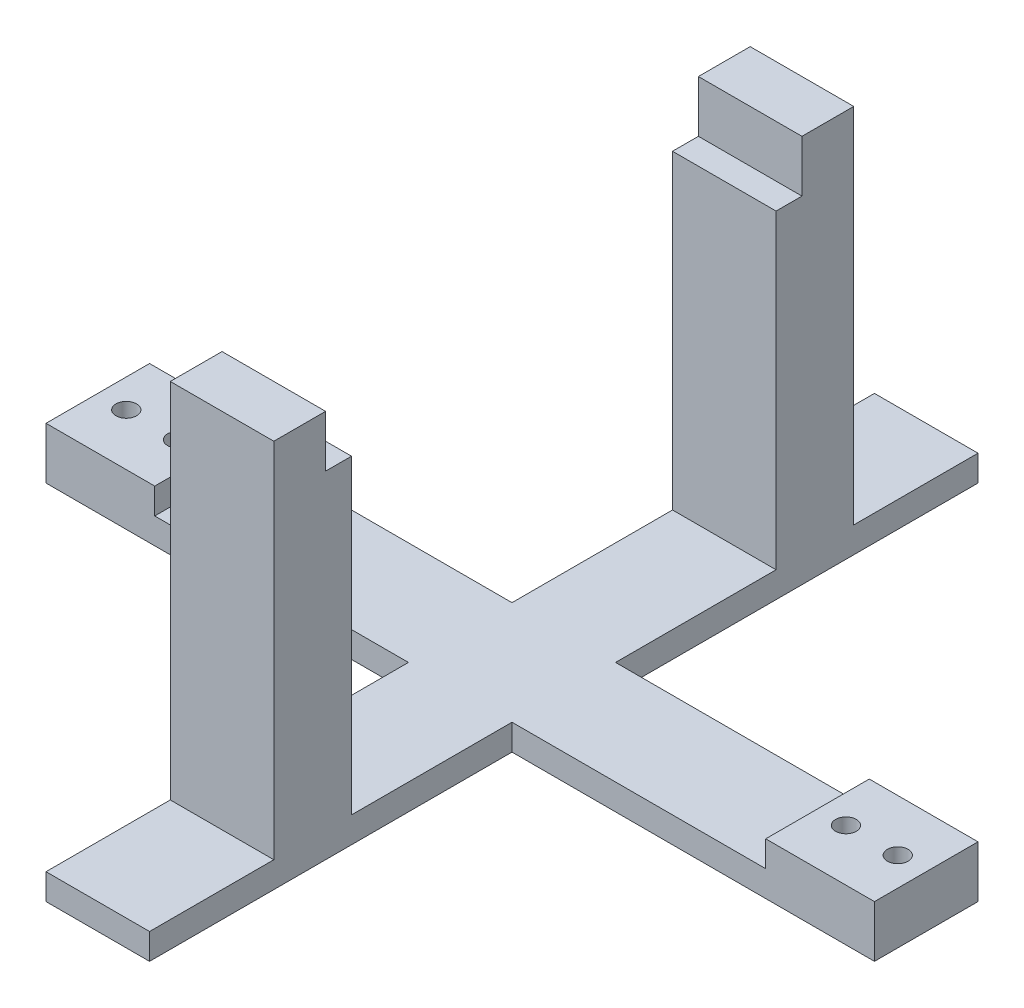
ISO-10303-21;
HEADER;
FILE_DESCRIPTION(('STEP AP214'),'2;1');
FILE_NAME('part.step','',(''),(''),'','','');
FILE_SCHEMA(('AUTOMOTIVE_DESIGN { 1 0 10303 214 1 1 1 1 }'));
ENDSEC;
DATA;
#1=APPLICATION_CONTEXT('core data for automotive mechanical design processes');
#2=APPLICATION_PROTOCOL_DEFINITION('international standard','automotive_design',2000,#1);
#3=PRODUCT_CONTEXT('',#1,'mechanical');
#4=PRODUCT('Part','Part','',(#3));
#5=PRODUCT_RELATED_PRODUCT_CATEGORY('part','',(#4));
#6=PRODUCT_DEFINITION_FORMATION('','',#4);
#7=PRODUCT_DEFINITION_CONTEXT('part definition',#1,'design');
#8=PRODUCT_DEFINITION('design','',#6,#7);
#9=PRODUCT_DEFINITION_SHAPE('','',#8);
#10=(LENGTH_UNIT() NAMED_UNIT(*) SI_UNIT(.MILLI.,.METRE.));
#11=(NAMED_UNIT(*) PLANE_ANGLE_UNIT() SI_UNIT($,.RADIAN.));
#12=(NAMED_UNIT(*) SI_UNIT($,.STERADIAN.) SOLID_ANGLE_UNIT());
#13=UNCERTAINTY_MEASURE_WITH_UNIT(LENGTH_MEASURE(1.E-05),#10,'distance_accuracy_value','');
#14=(GEOMETRIC_REPRESENTATION_CONTEXT(3) GLOBAL_UNCERTAINTY_ASSIGNED_CONTEXT((#13)) GLOBAL_UNIT_ASSIGNED_CONTEXT((#10,
#11,#12)) REPRESENTATION_CONTEXT('',''));
#15=CARTESIAN_POINT('',(0.,0.,0.));
#16=DIRECTION('',(0.,0.,1.));
#17=DIRECTION('',(1.,0.,0.));
#18=AXIS2_PLACEMENT_3D('',#15,#16,#17);
#19=CARTESIAN_POINT('',(0.,65.,0.));
#20=DIRECTION('',(0.,-1.,0.));
#21=DIRECTION('',(0.,0.,-1.));
#22=AXIS2_PLACEMENT_3D('',#19,#20,#21);
#23=PLANE('',#22);
#24=DIRECTION('',(-1.,0.,0.));
#25=VECTOR('',#24,1.);
#26=CARTESIAN_POINT('',(9.99999999999997,65.,46.));
#27=LINE('',#26,#25);
#28=CARTESIAN_POINT('',(9.99999999999998,65.,46.));
#29=VERTEX_POINT('',#28);
#30=CARTESIAN_POINT('',(-10.,65.,46.));
#31=VERTEX_POINT('',#30);
#32=EDGE_CURVE('E55',#29,#31,#27,.T.);
#33=ORIENTED_EDGE('',*,*,#32,.F.);
#34=DIRECTION('',(0.,0.,-1.));
#35=VECTOR('',#34,1.);
#36=CARTESIAN_POINT('',(9.99999999999998,65.,41.));
#37=LINE('',#36,#35);
#38=CARTESIAN_POINT('',(9.99999999999998,65.,41.));
#39=VERTEX_POINT('',#38);
#40=EDGE_CURVE('E308',#29,#39,#37,.T.);
#41=ORIENTED_EDGE('',*,*,#40,.T.);
#42=DIRECTION('',(-1.,0.,0.));
#43=VECTOR('',#42,1.);
#44=CARTESIAN_POINT('',(9.99999999999998,65.,41.));
#45=LINE('',#44,#43);
#46=CARTESIAN_POINT('',(-10.,65.,41.));
#47=VERTEX_POINT('',#46);
#48=EDGE_CURVE('E311',#39,#47,#45,.T.);
#49=ORIENTED_EDGE('',*,*,#48,.T.);
#50=DIRECTION('',(0.,0.,1.));
#51=VECTOR('',#50,1.);
#52=CARTESIAN_POINT('',(-10.,65.,41.));
#53=LINE('',#52,#51);
#54=EDGE_CURVE('E305',#47,#31,#53,.T.);
#55=ORIENTED_EDGE('',*,*,#54,.T.);
#56=EDGE_LOOP('',(#33,#41,#49,#55));
#57=FACE_BOUND('',#56,.T.);
#58=ADVANCED_FACE('F39',(#57),#23,.F.);
#59=CARTESIAN_POINT('',(0.,5.,0.));
#60=DIRECTION('',(0.,1.,0.));
#61=DIRECTION('',(0.,0.,1.));
#62=AXIS2_PLACEMENT_3D('',#59,#60,#61);
#63=PLANE('',#62);
#64=DIRECTION('',(0.,0.,1.));
#65=VECTOR('',#64,1.);
#66=CARTESIAN_POINT('',(-10.,5.,-9.99999999999999));
#67=LINE('',#66,#65);
#68=CARTESIAN_POINT('',(-10.,5.,-80.));
#69=VERTEX_POINT('',#68);
#70=CARTESIAN_POINT('',(-10.,5.,-56.));
#71=VERTEX_POINT('',#70);
#72=EDGE_CURVE('E383',#69,#71,#67,.T.);
#73=ORIENTED_EDGE('',*,*,#72,.T.);
#74=DIRECTION('',(-1.,0.,0.));
#75=VECTOR('',#74,1.);
#76=CARTESIAN_POINT('',(9.99999999999998,5.,-56.));
#77=LINE('',#76,#75);
#78=CARTESIAN_POINT('',(9.99999999999998,5.,-56.));
#79=VERTEX_POINT('',#78);
#80=EDGE_CURVE('E287',#79,#71,#77,.T.);
#81=ORIENTED_EDGE('',*,*,#80,.F.);
#82=DIRECTION('',(0.,0.,-1.));
#83=VECTOR('',#82,1.);
#84=CARTESIAN_POINT('',(9.99999999999998,5.,-9.99999999999999));
#85=LINE('',#84,#83);
#86=CARTESIAN_POINT('',(9.99999999999998,5.,-80.));
#87=VERTEX_POINT('',#86);
#88=EDGE_CURVE('E232',#79,#87,#85,.T.);
#89=ORIENTED_EDGE('',*,*,#88,.T.);
#90=DIRECTION('',(-1.,0.,0.));
#91=VECTOR('',#90,1.);
#92=CARTESIAN_POINT('',(9.99999999999998,5.,-80.));
#93=LINE('',#92,#91);
#94=EDGE_CURVE('E380',#87,#69,#93,.T.);
#95=ORIENTED_EDGE('',*,*,#94,.T.);
#96=EDGE_LOOP('',(#73,#81,#89,#95));
#97=FACE_BOUND('',#96,.T.);
#98=ADVANCED_FACE('F554',(#97),#63,.T.);
#99=CARTESIAN_POINT('',(9.99999999999998,5.,-9.99999999999999));
#100=VERTEX_POINT('',#99);
#101=CARTESIAN_POINT('',(9.99999999999998,5.,-41.));
#102=VERTEX_POINT('',#101);
#103=EDGE_CURVE('E377',#100,#102,#85,.T.);
#104=ORIENTED_EDGE('',*,*,#103,.T.);
#105=DIRECTION('',(1.,0.,0.));
#106=VECTOR('',#105,1.);
#107=CARTESIAN_POINT('',(9.99999999999998,5.,-41.));
#108=LINE('',#107,#106);
#109=CARTESIAN_POINT('',(-10.,5.,-41.));
#110=VERTEX_POINT('',#109);
#111=EDGE_CURVE('E282',#110,#102,#108,.T.);
#112=ORIENTED_EDGE('',*,*,#111,.F.);
#113=CARTESIAN_POINT('',(-10.,5.,-9.99999999999999));
#114=VERTEX_POINT('',#113);
#115=EDGE_CURVE('E382',#110,#114,#67,.T.);
#116=ORIENTED_EDGE('',*,*,#115,.T.);
#117=DIRECTION('',(-1.,0.,0.));
#118=VECTOR('',#117,1.);
#119=CARTESIAN_POINT('',(-80.,5.,-9.99999999999998));
#120=LINE('',#119,#118);
#121=CARTESIAN_POINT('',(-59.,5.,-9.99999999999998));
#122=VERTEX_POINT('',#121);
#123=EDGE_CURVE('E386',#114,#122,#120,.T.);
#124=ORIENTED_EDGE('',*,*,#123,.T.);
#125=DIRECTION('',(0.,0.,-1.));
#126=VECTOR('',#125,1.);
#127=CARTESIAN_POINT('',(-59.,5.,-9.99999999999998));
#128=LINE('',#127,#126);
#129=CARTESIAN_POINT('',(-59.,5.,10.));
#130=VERTEX_POINT('',#129);
#131=EDGE_CURVE('E354',#130,#122,#128,.T.);
#132=ORIENTED_EDGE('',*,*,#131,.F.);
#133=DIRECTION('',(1.,0.,0.));
#134=VECTOR('',#133,1.);
#135=CARTESIAN_POINT('',(-80.,5.,10.));
#136=LINE('',#135,#134);
#137=CARTESIAN_POINT('',(-10.,5.,10.));
#138=VERTEX_POINT('',#137);
#139=EDGE_CURVE('E388',#130,#138,#136,.T.);
#140=ORIENTED_EDGE('',*,*,#139,.T.);
#141=DIRECTION('',(0.,0.,1.));
#142=VECTOR('',#141,1.);
#143=CARTESIAN_POINT('',(-10.,5.,80.));
#144=LINE('',#143,#142);
#145=CARTESIAN_POINT('',(-10.,5.,41.));
#146=VERTEX_POINT('',#145);
#147=EDGE_CURVE('E391',#138,#146,#144,.T.);
#148=ORIENTED_EDGE('',*,*,#147,.T.);
#149=DIRECTION('',(-1.,0.,0.));
#150=VECTOR('',#149,1.);
#151=CARTESIAN_POINT('',(9.99999999999998,5.,41.));
#152=LINE('',#151,#150);
#153=CARTESIAN_POINT('',(9.99999999999998,5.,41.));
#154=VERTEX_POINT('',#153);
#155=EDGE_CURVE('E289',#154,#146,#152,.T.);
#156=ORIENTED_EDGE('',*,*,#155,.F.);
#157=DIRECTION('',(0.,0.,-1.));
#158=VECTOR('',#157,1.);
#159=CARTESIAN_POINT('',(9.99999999999998,5.,80.));
#160=LINE('',#159,#158);
#161=CARTESIAN_POINT('',(9.99999999999998,5.,10.));
#162=VERTEX_POINT('',#161);
#163=EDGE_CURVE('E396',#154,#162,#160,.T.);
#164=ORIENTED_EDGE('',*,*,#163,.T.);
#165=DIRECTION('',(1.,0.,0.));
#166=VECTOR('',#165,1.);
#167=CARTESIAN_POINT('',(9.99999999999998,5.,10.));
#168=LINE('',#167,#166);
#169=CARTESIAN_POINT('',(59.,5.,10.));
#170=VERTEX_POINT('',#169);
#171=EDGE_CURVE('E400',#162,#170,#168,.T.);
#172=ORIENTED_EDGE('',*,*,#171,.T.);
#173=DIRECTION('',(0.,0.,-1.));
#174=VECTOR('',#173,1.);
#175=CARTESIAN_POINT('',(59.,5.,-9.99999999999998));
#176=LINE('',#175,#174);
#177=CARTESIAN_POINT('',(59.,5.,-10.));
#178=VERTEX_POINT('',#177);
#179=EDGE_CURVE('E326',#170,#178,#176,.T.);
#180=ORIENTED_EDGE('',*,*,#179,.T.);
#181=DIRECTION('',(-1.,0.,0.));
#182=VECTOR('',#181,1.);
#183=CARTESIAN_POINT('',(9.99999999999998,5.,-9.99999999999999));
#184=LINE('',#183,#182);
#185=EDGE_CURVE('E374',#178,#100,#184,.T.);
#186=ORIENTED_EDGE('',*,*,#185,.T.);
#187=EDGE_LOOP('',(#104,#112,#116,#124,#132,#140,#148,#156,#164,#172,#180,#186));
#188=FACE_BOUND('',#187,.T.);
#189=ADVANCED_FACE('F478',(#188),#63,.T.);
#190=CARTESIAN_POINT('',(9.99999999999998,5.,80.));
#191=VERTEX_POINT('',#190);
#192=CARTESIAN_POINT('',(9.99999999999998,5.,56.));
#193=VERTEX_POINT('',#192);
#194=EDGE_CURVE('E397',#191,#193,#160,.T.);
#195=ORIENTED_EDGE('',*,*,#194,.T.);
#196=DIRECTION('',(1.,0.,0.));
#197=VECTOR('',#196,1.);
#198=CARTESIAN_POINT('',(9.99999999999998,5.,56.));
#199=LINE('',#198,#197);
#200=CARTESIAN_POINT('',(-10.,5.,56.));
#201=VERTEX_POINT('',#200);
#202=EDGE_CURVE('E306',#201,#193,#199,.T.);
#203=ORIENTED_EDGE('',*,*,#202,.F.);
#204=CARTESIAN_POINT('',(-10.,5.,80.));
#205=VERTEX_POINT('',#204);
#206=EDGE_CURVE('E390',#201,#205,#144,.T.);
#207=ORIENTED_EDGE('',*,*,#206,.T.);
#208=DIRECTION('',(1.,0.,0.));
#209=VECTOR('',#208,1.);
#210=CARTESIAN_POINT('',(9.99999999999998,5.,80.));
#211=LINE('',#210,#209);
#212=EDGE_CURVE('E394',#205,#191,#211,.T.);
#213=ORIENTED_EDGE('',*,*,#212,.T.);
#214=EDGE_LOOP('',(#195,#203,#207,#213));
#215=FACE_BOUND('',#214,.T.);
#216=ADVANCED_FACE('F563',(#215),#63,.T.);
#217=CARTESIAN_POINT('',(9.99999999999998,5.,-9.99999999999999));
#218=DIRECTION('',(0.,0.,1.));
#219=DIRECTION('',(1.,0.,0.));
#220=AXIS2_PLACEMENT_3D('',#217,#218,#219);
#221=PLANE('',#220);
#222=DIRECTION('',(-1.,0.,0.));
#223=VECTOR('',#222,1.);
#224=CARTESIAN_POINT('',(9.99999999999998,0.,-9.99999999999999));
#225=LINE('',#224,#223);
#226=CARTESIAN_POINT('',(80.,0.,-10.));
#227=VERTEX_POINT('',#226);
#228=CARTESIAN_POINT('',(9.99999999999998,0.,-9.99999999999999));
#229=VERTEX_POINT('',#228);
#230=EDGE_CURVE('E373',#227,#229,#225,.T.);
#231=ORIENTED_EDGE('',*,*,#230,.T.);
#232=DIRECTION('',(0.,-1.,0.));
#233=VECTOR('',#232,1.);
#234=CARTESIAN_POINT('',(9.99999999999998,5.,-9.99999999999999));
#235=LINE('',#234,#233);
#236=EDGE_CURVE('E11',#100,#229,#235,.T.);
#237=ORIENTED_EDGE('',*,*,#236,.F.);
#238=ORIENTED_EDGE('',*,*,#185,.F.);
#239=DIRECTION('',(0.,-1.,0.));
#240=VECTOR('',#239,1.);
#241=CARTESIAN_POINT('',(59.,10.,-9.99999999999998));
#242=LINE('',#241,#240);
#243=CARTESIAN_POINT('',(59.,10.,-9.99999999999998));
#244=VERTEX_POINT('',#243);
#245=EDGE_CURVE('E339',#244,#178,#242,.T.);
#246=ORIENTED_EDGE('',*,*,#245,.F.);
#247=DIRECTION('',(1.,0.,0.));
#248=VECTOR('',#247,1.);
#249=CARTESIAN_POINT('',(80.,10.,-9.99999999999998));
#250=LINE('',#249,#248);
#251=CARTESIAN_POINT('',(80.,10.,-9.99999999999998));
#252=VERTEX_POINT('',#251);
#253=EDGE_CURVE('E325',#244,#252,#250,.T.);
#254=ORIENTED_EDGE('',*,*,#253,.T.);
#255=DIRECTION('',(0.,-1.,0.));
#256=VECTOR('',#255,1.);
#257=CARTESIAN_POINT('',(80.,5.,-10.));
#258=LINE('',#257,#256);
#259=EDGE_CURVE('E402',#252,#227,#258,.T.);
#260=ORIENTED_EDGE('',*,*,#259,.T.);
#261=EDGE_LOOP('',(#231,#237,#238,#246,#254,#260));
#262=FACE_BOUND('',#261,.T.);
#263=ADVANCED_FACE('F41',(#262),#221,.F.);
#264=CARTESIAN_POINT('',(9.99999999999998,5.,-9.99999999999999));
#265=DIRECTION('',(-1.,0.,0.));
#266=DIRECTION('',(0.,0.,1.));
#267=AXIS2_PLACEMENT_3D('',#264,#265,#266);
#268=PLANE('',#267);
#269=DIRECTION('',(0.,0.,-1.));
#270=VECTOR('',#269,1.);
#271=CARTESIAN_POINT('',(9.99999999999998,0.,-9.99999999999999));
#272=LINE('',#271,#270);
#273=CARTESIAN_POINT('',(9.99999999999998,0.,-80.));
#274=VERTEX_POINT('',#273);
#275=EDGE_CURVE('E405',#229,#274,#272,.T.);
#276=ORIENTED_EDGE('',*,*,#275,.T.);
#277=DIRECTION('',(0.,-1.,0.));
#278=VECTOR('',#277,1.);
#279=CARTESIAN_POINT('',(9.99999999999998,5.,-80.));
#280=LINE('',#279,#278);
#281=EDGE_CURVE('E48',#87,#274,#280,.T.);
#282=ORIENTED_EDGE('',*,*,#281,.F.);
#283=ORIENTED_EDGE('',*,*,#88,.F.);
#284=DIRECTION('',(0.,-1.,0.));
#285=VECTOR('',#284,1.);
#286=CARTESIAN_POINT('',(9.99999999999998,65.,-56.));
#287=LINE('',#286,#285);
#288=CARTESIAN_POINT('',(9.99999999999998,75.,-56.));
#289=VERTEX_POINT('',#288);
#290=EDGE_CURVE('E225',#289,#79,#287,.T.);
#291=ORIENTED_EDGE('',*,*,#290,.F.);
#292=DIRECTION('',(0.,0.,-1.));
#293=VECTOR('',#292,1.);
#294=CARTESIAN_POINT('',(9.99999999999998,75.,-46.));
#295=LINE('',#294,#293);
#296=CARTESIAN_POINT('',(9.99999999999998,75.,-46.));
#297=VERTEX_POINT('',#296);
#298=EDGE_CURVE('E230',#297,#289,#295,.T.);
#299=ORIENTED_EDGE('',*,*,#298,.F.);
#300=DIRECTION('',(0.,-1.,0.));
#301=VECTOR('',#300,1.);
#302=CARTESIAN_POINT('',(9.99999999999998,75.,-46.));
#303=LINE('',#302,#301);
#304=CARTESIAN_POINT('',(9.99999999999998,65.,-46.));
#305=VERTEX_POINT('',#304);
#306=EDGE_CURVE('E254',#297,#305,#303,.T.);
#307=ORIENTED_EDGE('',*,*,#306,.T.);
#308=DIRECTION('',(0.,0.,-1.));
#309=VECTOR('',#308,1.);
#310=CARTESIAN_POINT('',(9.99999999999998,65.,-41.));
#311=LINE('',#310,#309);
#312=CARTESIAN_POINT('',(9.99999999999998,65.,-41.));
#313=VERTEX_POINT('',#312);
#314=EDGE_CURVE('E279',#313,#305,#311,.T.);
#315=ORIENTED_EDGE('',*,*,#314,.F.);
#316=DIRECTION('',(0.,-1.,0.));
#317=VECTOR('',#316,1.);
#318=CARTESIAN_POINT('',(9.99999999999998,65.,-41.));
#319=LINE('',#318,#317);
#320=EDGE_CURVE('E286',#313,#102,#319,.T.);
#321=ORIENTED_EDGE('',*,*,#320,.T.);
#322=ORIENTED_EDGE('',*,*,#103,.F.);
#323=ORIENTED_EDGE('',*,*,#236,.T.);
#324=EDGE_LOOP('',(#276,#282,#283,#291,#299,#307,#315,#321,#322,#323));
#325=FACE_BOUND('',#324,.T.);
#326=ADVANCED_FACE('F227',(#325),#268,.F.);
#327=CARTESIAN_POINT('',(9.99999999999998,5.,-80.));
#328=DIRECTION('',(0.,0.,1.));
#329=DIRECTION('',(1.,0.,0.));
#330=AXIS2_PLACEMENT_3D('',#327,#328,#329);
#331=PLANE('',#330);
#332=DIRECTION('',(-1.,0.,0.));
#333=VECTOR('',#332,1.);
#334=CARTESIAN_POINT('',(9.99999999999998,0.,-80.));
#335=LINE('',#334,#333);
#336=CARTESIAN_POINT('',(-10.,0.,-80.));
#337=VERTEX_POINT('',#336);
#338=EDGE_CURVE('E407',#274,#337,#335,.T.);
#339=ORIENTED_EDGE('',*,*,#338,.T.);
#340=DIRECTION('',(0.,-1.,0.));
#341=VECTOR('',#340,1.);
#342=CARTESIAN_POINT('',(-10.,5.,-80.));
#343=LINE('',#342,#341);
#344=EDGE_CURVE('E452',#69,#337,#343,.T.);
#345=ORIENTED_EDGE('',*,*,#344,.F.);
#346=ORIENTED_EDGE('',*,*,#94,.F.);
#347=ORIENTED_EDGE('',*,*,#281,.T.);
#348=EDGE_LOOP('',(#339,#345,#346,#347));
#349=FACE_BOUND('',#348,.T.);
#350=ADVANCED_FACE('F459',(#349),#331,.F.);
#351=CARTESIAN_POINT('',(-10.,5.,-9.99999999999999));
#352=DIRECTION('',(1.,0.,0.));
#353=DIRECTION('',(0.,0.,-1.));
#354=AXIS2_PLACEMENT_3D('',#351,#352,#353);
#355=PLANE('',#354);
#356=DIRECTION('',(0.,0.,1.));
#357=VECTOR('',#356,1.);
#358=CARTESIAN_POINT('',(-10.,0.,-9.99999999999999));
#359=LINE('',#358,#357);
#360=CARTESIAN_POINT('',(-10.,0.,-9.99999999999999));
#361=VERTEX_POINT('',#360);
#362=EDGE_CURVE('E409',#337,#361,#359,.T.);
#363=ORIENTED_EDGE('',*,*,#362,.T.);
#364=DIRECTION('',(0.,-1.,0.));
#365=VECTOR('',#364,1.);
#366=CARTESIAN_POINT('',(-10.,5.,-9.99999999999999));
#367=LINE('',#366,#365);
#368=EDGE_CURVE('E449',#114,#361,#367,.T.);
#369=ORIENTED_EDGE('',*,*,#368,.F.);
#370=ORIENTED_EDGE('',*,*,#115,.F.);
#371=DIRECTION('',(0.,-1.,0.));
#372=VECTOR('',#371,1.);
#373=CARTESIAN_POINT('',(-10.,65.,-41.));
#374=LINE('',#373,#372);
#375=CARTESIAN_POINT('',(-10.,65.,-41.));
#376=VERTEX_POINT('',#375);
#377=EDGE_CURVE('E293',#376,#110,#374,.T.);
#378=ORIENTED_EDGE('',*,*,#377,.F.);
#379=DIRECTION('',(0.,0.,1.));
#380=VECTOR('',#379,1.);
#381=CARTESIAN_POINT('',(-10.,65.,-41.));
#382=LINE('',#381,#380);
#383=CARTESIAN_POINT('',(-10.,65.,-46.));
#384=VERTEX_POINT('',#383);
#385=EDGE_CURVE('E281',#384,#376,#382,.T.);
#386=ORIENTED_EDGE('',*,*,#385,.F.);
#387=DIRECTION('',(0.,-1.,0.));
#388=VECTOR('',#387,1.);
#389=CARTESIAN_POINT('',(-10.,75.,-46.));
#390=LINE('',#389,#388);
#391=CARTESIAN_POINT('',(-10.,75.,-46.));
#392=VERTEX_POINT('',#391);
#393=EDGE_CURVE('E257',#392,#384,#390,.T.);
#394=ORIENTED_EDGE('',*,*,#393,.F.);
#395=DIRECTION('',(0.,0.,1.));
#396=VECTOR('',#395,1.);
#397=CARTESIAN_POINT('',(-10.,75.,-46.));
#398=LINE('',#397,#396);
#399=CARTESIAN_POINT('',(-10.,75.,-56.));
#400=VERTEX_POINT('',#399);
#401=EDGE_CURVE('E244',#400,#392,#398,.T.);
#402=ORIENTED_EDGE('',*,*,#401,.F.);
#403=DIRECTION('',(0.,-1.,0.));
#404=VECTOR('',#403,1.);
#405=CARTESIAN_POINT('',(-10.,65.,-56.));
#406=LINE('',#405,#404);
#407=EDGE_CURVE('E236',#400,#71,#406,.T.);
#408=ORIENTED_EDGE('',*,*,#407,.T.);
#409=ORIENTED_EDGE('',*,*,#72,.F.);
#410=ORIENTED_EDGE('',*,*,#344,.T.);
#411=EDGE_LOOP('',(#363,#369,#370,#378,#386,#394,#402,#408,#409,#410));
#412=FACE_BOUND('',#411,.T.);
#413=ADVANCED_FACE('F469',(#412),#355,.F.);
#414=CARTESIAN_POINT('',(-80.,5.,-9.99999999999998));
#415=DIRECTION('',(0.,0.,1.));
#416=DIRECTION('',(1.,0.,0.));
#417=AXIS2_PLACEMENT_3D('',#414,#415,#416);
#418=PLANE('',#417);
#419=DIRECTION('',(-1.,0.,0.));
#420=VECTOR('',#419,1.);
#421=CARTESIAN_POINT('',(-80.,0.,-9.99999999999998));
#422=LINE('',#421,#420);
#423=CARTESIAN_POINT('',(-80.,0.,-9.99999999999998));
#424=VERTEX_POINT('',#423);
#425=EDGE_CURVE('E411',#361,#424,#422,.T.);
#426=ORIENTED_EDGE('',*,*,#425,.T.);
#427=DIRECTION('',(0.,-1.,0.));
#428=VECTOR('',#427,1.);
#429=CARTESIAN_POINT('',(-80.,5.,-9.99999999999998));
#430=LINE('',#429,#428);
#431=CARTESIAN_POINT('',(-80.,10.,-9.99999999999998));
#432=VERTEX_POINT('',#431);
#433=EDGE_CURVE('E446',#432,#424,#430,.T.);
#434=ORIENTED_EDGE('',*,*,#433,.F.);
#435=DIRECTION('',(-1.,0.,0.));
#436=VECTOR('',#435,1.);
#437=CARTESIAN_POINT('',(-80.,10.,-9.99999999999998));
#438=LINE('',#437,#436);
#439=CARTESIAN_POINT('',(-59.,10.,-9.99999999999998));
#440=VERTEX_POINT('',#439);
#441=EDGE_CURVE('E362',#440,#432,#438,.T.);
#442=ORIENTED_EDGE('',*,*,#441,.F.);
#443=DIRECTION('',(0.,-1.,0.));
#444=VECTOR('',#443,1.);
#445=CARTESIAN_POINT('',(-59.,10.,-9.99999999999998));
#446=LINE('',#445,#444);
#447=EDGE_CURVE('E365',#440,#122,#446,.T.);
#448=ORIENTED_EDGE('',*,*,#447,.T.);
#449=ORIENTED_EDGE('',*,*,#123,.F.);
#450=ORIENTED_EDGE('',*,*,#368,.T.);
#451=EDGE_LOOP('',(#426,#434,#442,#448,#449,#450));
#452=FACE_BOUND('',#451,.T.);
#453=ADVANCED_FACE('F474',(#452),#418,.F.);
#454=CARTESIAN_POINT('',(-80.,5.,10.));
#455=DIRECTION('',(1.,0.,0.));
#456=DIRECTION('',(0.,0.,-1.));
#457=AXIS2_PLACEMENT_3D('',#454,#455,#456);
#458=PLANE('',#457);
#459=DIRECTION('',(0.,0.,1.));
#460=VECTOR('',#459,1.);
#461=CARTESIAN_POINT('',(-80.,0.,10.));
#462=LINE('',#461,#460);
#463=CARTESIAN_POINT('',(-80.,0.,10.));
#464=VERTEX_POINT('',#463);
#465=EDGE_CURVE('E413',#424,#464,#462,.T.);
#466=ORIENTED_EDGE('',*,*,#465,.T.);
#467=DIRECTION('',(0.,-1.,0.));
#468=VECTOR('',#467,1.);
#469=CARTESIAN_POINT('',(-80.,5.,10.));
#470=LINE('',#469,#468);
#471=CARTESIAN_POINT('',(-80.,10.,10.));
#472=VERTEX_POINT('',#471);
#473=EDGE_CURVE('E443',#472,#464,#470,.T.);
#474=ORIENTED_EDGE('',*,*,#473,.F.);
#475=DIRECTION('',(0.,0.,1.));
#476=VECTOR('',#475,1.);
#477=CARTESIAN_POINT('',(-80.,10.,-9.99999999999998));
#478=LINE('',#477,#476);
#479=EDGE_CURVE('E355',#432,#472,#478,.T.);
#480=ORIENTED_EDGE('',*,*,#479,.F.);
#481=ORIENTED_EDGE('',*,*,#433,.T.);
#482=EDGE_LOOP('',(#466,#474,#480,#481));
#483=FACE_BOUND('',#482,.T.);
#484=ADVANCED_FACE('F536',(#483),#458,.F.);
#485=CARTESIAN_POINT('',(-80.,5.,10.));
#486=DIRECTION('',(0.,0.,-1.));
#487=DIRECTION('',(-1.,0.,0.));
#488=AXIS2_PLACEMENT_3D('',#485,#486,#487);
#489=PLANE('',#488);
#490=DIRECTION('',(1.,0.,0.));
#491=VECTOR('',#490,1.);
#492=CARTESIAN_POINT('',(-80.,0.,10.));
#493=LINE('',#492,#491);
#494=CARTESIAN_POINT('',(-10.,0.,10.));
#495=VERTEX_POINT('',#494);
#496=EDGE_CURVE('E415',#464,#495,#493,.T.);
#497=ORIENTED_EDGE('',*,*,#496,.T.);
#498=DIRECTION('',(0.,-1.,0.));
#499=VECTOR('',#498,1.);
#500=CARTESIAN_POINT('',(-10.,5.,10.));
#501=LINE('',#500,#499);
#502=EDGE_CURVE('E440',#138,#495,#501,.T.);
#503=ORIENTED_EDGE('',*,*,#502,.F.);
#504=ORIENTED_EDGE('',*,*,#139,.F.);
#505=DIRECTION('',(0.,-1.,0.));
#506=VECTOR('',#505,1.);
#507=CARTESIAN_POINT('',(-59.,10.,10.));
#508=LINE('',#507,#506);
#509=CARTESIAN_POINT('',(-59.,10.,10.));
#510=VERTEX_POINT('',#509);
#511=EDGE_CURVE('E370',#510,#130,#508,.T.);
#512=ORIENTED_EDGE('',*,*,#511,.F.);
#513=DIRECTION('',(1.,0.,0.));
#514=VECTOR('',#513,1.);
#515=CARTESIAN_POINT('',(-80.,10.,10.));
#516=LINE('',#515,#514);
#517=EDGE_CURVE('E358',#472,#510,#516,.T.);
#518=ORIENTED_EDGE('',*,*,#517,.F.);
#519=ORIENTED_EDGE('',*,*,#473,.T.);
#520=EDGE_LOOP('',(#497,#503,#504,#512,#518,#519));
#521=FACE_BOUND('',#520,.T.);
#522=ADVANCED_FACE('F487',(#521),#489,.F.);
#523=CARTESIAN_POINT('',(-10.,5.,80.));
#524=DIRECTION('',(1.,0.,0.));
#525=DIRECTION('',(0.,0.,-1.));
#526=AXIS2_PLACEMENT_3D('',#523,#524,#525);
#527=PLANE('',#526);
#528=DIRECTION('',(0.,0.,1.));
#529=VECTOR('',#528,1.);
#530=CARTESIAN_POINT('',(-10.,0.,80.));
#531=LINE('',#530,#529);
#532=CARTESIAN_POINT('',(-10.,0.,80.));
#533=VERTEX_POINT('',#532);
#534=EDGE_CURVE('E417',#495,#533,#531,.T.);
#535=ORIENTED_EDGE('',*,*,#534,.T.);
#536=DIRECTION('',(0.,-1.,0.));
#537=VECTOR('',#536,1.);
#538=CARTESIAN_POINT('',(-10.,5.,80.));
#539=LINE('',#538,#537);
#540=EDGE_CURVE('E437',#205,#533,#539,.T.);
#541=ORIENTED_EDGE('',*,*,#540,.F.);
#542=ORIENTED_EDGE('',*,*,#206,.F.);
#543=DIRECTION('',(0.,-1.,0.));
#544=VECTOR('',#543,1.);
#545=CARTESIAN_POINT('',(-10.,65.,56.));
#546=LINE('',#545,#544);
#547=CARTESIAN_POINT('',(-10.,75.,56.));
#548=VERTEX_POINT('',#547);
#549=EDGE_CURVE('E300',#548,#201,#546,.T.);
#550=ORIENTED_EDGE('',*,*,#549,.F.);
#551=DIRECTION('',(0.,0.,1.));
#552=VECTOR('',#551,1.);
#553=CARTESIAN_POINT('',(-10.,75.,46.));
#554=LINE('',#553,#552);
#555=CARTESIAN_POINT('',(-10.,75.,46.));
#556=VERTEX_POINT('',#555);
#557=EDGE_CURVE('E272',#556,#548,#554,.T.);
#558=ORIENTED_EDGE('',*,*,#557,.F.);
#559=DIRECTION('',(0.,-1.,0.));
#560=VECTOR('',#559,1.);
#561=CARTESIAN_POINT('',(-10.,75.,46.));
#562=LINE('',#561,#560);
#563=EDGE_CURVE('E264',#556,#31,#562,.T.);
#564=ORIENTED_EDGE('',*,*,#563,.T.);
#565=ORIENTED_EDGE('',*,*,#54,.F.);
#566=DIRECTION('',(0.,-1.,0.));
#567=VECTOR('',#566,1.);
#568=CARTESIAN_POINT('',(-10.,65.,41.));
#569=LINE('',#568,#567);
#570=EDGE_CURVE('E297',#47,#146,#569,.T.);
#571=ORIENTED_EDGE('',*,*,#570,.T.);
#572=ORIENTED_EDGE('',*,*,#147,.F.);
#573=ORIENTED_EDGE('',*,*,#502,.T.);
#574=EDGE_LOOP('',(#535,#541,#542,#550,#558,#564,#565,#571,#572,#573));
#575=FACE_BOUND('',#574,.T.);
#576=ADVANCED_FACE('F493',(#575),#527,.F.);
#577=CARTESIAN_POINT('',(9.99999999999998,5.,80.));
#578=DIRECTION('',(0.,0.,-1.));
#579=DIRECTION('',(-1.,0.,0.));
#580=AXIS2_PLACEMENT_3D('',#577,#578,#579);
#581=PLANE('',#580);
#582=DIRECTION('',(1.,0.,0.));
#583=VECTOR('',#582,1.);
#584=CARTESIAN_POINT('',(9.99999999999998,0.,80.));
#585=LINE('',#584,#583);
#586=CARTESIAN_POINT('',(9.99999999999998,0.,80.));
#587=VERTEX_POINT('',#586);
#588=EDGE_CURVE('E419',#533,#587,#585,.T.);
#589=ORIENTED_EDGE('',*,*,#588,.T.);
#590=DIRECTION('',(0.,-1.,0.));
#591=VECTOR('',#590,1.);
#592=CARTESIAN_POINT('',(9.99999999999998,5.,80.));
#593=LINE('',#592,#591);
#594=EDGE_CURVE('E434',#191,#587,#593,.T.);
#595=ORIENTED_EDGE('',*,*,#594,.F.);
#596=ORIENTED_EDGE('',*,*,#212,.F.);
#597=ORIENTED_EDGE('',*,*,#540,.T.);
#598=EDGE_LOOP('',(#589,#595,#596,#597));
#599=FACE_BOUND('',#598,.T.);
#600=ADVANCED_FACE('F530',(#599),#581,.F.);
#601=CARTESIAN_POINT('',(9.99999999999998,5.,80.));
#602=DIRECTION('',(-1.,0.,0.));
#603=DIRECTION('',(0.,0.,1.));
#604=AXIS2_PLACEMENT_3D('',#601,#602,#603);
#605=PLANE('',#604);
#606=DIRECTION('',(0.,0.,-1.));
#607=VECTOR('',#606,1.);
#608=CARTESIAN_POINT('',(9.99999999999998,0.,80.));
#609=LINE('',#608,#607);
#610=CARTESIAN_POINT('',(9.99999999999998,0.,10.));
#611=VERTEX_POINT('',#610);
#612=EDGE_CURVE('E421',#587,#611,#609,.T.);
#613=ORIENTED_EDGE('',*,*,#612,.T.);
#614=DIRECTION('',(0.,-1.,0.));
#615=VECTOR('',#614,1.);
#616=CARTESIAN_POINT('',(9.99999999999998,5.,10.));
#617=LINE('',#616,#615);
#618=EDGE_CURVE('E431',#162,#611,#617,.T.);
#619=ORIENTED_EDGE('',*,*,#618,.F.);
#620=ORIENTED_EDGE('',*,*,#163,.F.);
#621=DIRECTION('',(0.,-1.,0.));
#622=VECTOR('',#621,1.);
#623=CARTESIAN_POINT('',(9.99999999999998,65.,41.));
#624=LINE('',#623,#622);
#625=EDGE_CURVE('E260',#39,#154,#624,.T.);
#626=ORIENTED_EDGE('',*,*,#625,.F.);
#627=ORIENTED_EDGE('',*,*,#40,.F.);
#628=DIRECTION('',(0.,-1.,0.));
#629=VECTOR('',#628,1.);
#630=CARTESIAN_POINT('',(9.99999999999997,75.,46.));
#631=LINE('',#630,#629);
#632=CARTESIAN_POINT('',(9.99999999999997,75.,46.));
#633=VERTEX_POINT('',#632);
#634=EDGE_CURVE('E261',#633,#29,#631,.T.);
#635=ORIENTED_EDGE('',*,*,#634,.F.);
#636=DIRECTION('',(0.,0.,-1.));
#637=VECTOR('',#636,1.);
#638=CARTESIAN_POINT('',(9.99999999999997,75.,46.));
#639=LINE('',#638,#637);
#640=CARTESIAN_POINT('',(9.99999999999997,75.,56.));
#641=VERTEX_POINT('',#640);
#642=EDGE_CURVE('E269',#641,#633,#639,.T.);
#643=ORIENTED_EDGE('',*,*,#642,.F.);
#644=DIRECTION('',(0.,-1.,0.));
#645=VECTOR('',#644,1.);
#646=CARTESIAN_POINT('',(9.99999999999998,65.,56.));
#647=LINE('',#646,#645);
#648=EDGE_CURVE('E302',#641,#193,#647,.T.);
#649=ORIENTED_EDGE('',*,*,#648,.T.);
#650=ORIENTED_EDGE('',*,*,#194,.F.);
#651=ORIENTED_EDGE('',*,*,#594,.T.);
#652=EDGE_LOOP('',(#613,#619,#620,#626,#627,#635,#643,#649,#650,#651));
#653=FACE_BOUND('',#652,.T.);
#654=ADVANCED_FACE('F502',(#653),#605,.F.);
#655=CARTESIAN_POINT('',(9.99999999999998,5.,10.));
#656=DIRECTION('',(0.,0.,-1.));
#657=DIRECTION('',(-1.,0.,0.));
#658=AXIS2_PLACEMENT_3D('',#655,#656,#657);
#659=PLANE('',#658);
#660=DIRECTION('',(1.,0.,0.));
#661=VECTOR('',#660,1.);
#662=CARTESIAN_POINT('',(9.99999999999998,0.,10.));
#663=LINE('',#662,#661);
#664=CARTESIAN_POINT('',(80.,0.,9.99999999999999));
#665=VERTEX_POINT('',#664);
#666=EDGE_CURVE('E423',#611,#665,#663,.T.);
#667=ORIENTED_EDGE('',*,*,#666,.T.);
#668=DIRECTION('',(0.,-1.,0.));
#669=VECTOR('',#668,1.);
#670=CARTESIAN_POINT('',(80.,5.,9.99999999999999));
#671=LINE('',#670,#669);
#672=CARTESIAN_POINT('',(80.,10.,10.));
#673=VERTEX_POINT('',#672);
#674=EDGE_CURVE('E428',#673,#665,#671,.T.);
#675=ORIENTED_EDGE('',*,*,#674,.F.);
#676=DIRECTION('',(-1.,0.,0.));
#677=VECTOR('',#676,1.);
#678=CARTESIAN_POINT('',(80.,10.,10.));
#679=LINE('',#678,#677);
#680=CARTESIAN_POINT('',(59.,10.,10.));
#681=VERTEX_POINT('',#680);
#682=EDGE_CURVE('E332',#673,#681,#679,.T.);
#683=ORIENTED_EDGE('',*,*,#682,.T.);
#684=DIRECTION('',(0.,-1.,0.));
#685=VECTOR('',#684,1.);
#686=CARTESIAN_POINT('',(59.,10.,10.));
#687=LINE('',#686,#685);
#688=EDGE_CURVE('E335',#681,#170,#687,.T.);
#689=ORIENTED_EDGE('',*,*,#688,.T.);
#690=ORIENTED_EDGE('',*,*,#171,.F.);
#691=ORIENTED_EDGE('',*,*,#618,.T.);
#692=EDGE_LOOP('',(#667,#675,#683,#689,#690,#691));
#693=FACE_BOUND('',#692,.T.);
#694=ADVANCED_FACE('F509',(#693),#659,.F.);
#695=CARTESIAN_POINT('',(80.,5.,9.99999999999999));
#696=DIRECTION('',(-1.,0.,0.));
#697=DIRECTION('',(0.,0.,1.));
#698=AXIS2_PLACEMENT_3D('',#695,#696,#697);
#699=PLANE('',#698);
#700=DIRECTION('',(0.,0.,-1.));
#701=VECTOR('',#700,1.);
#702=CARTESIAN_POINT('',(80.,0.,9.99999999999999));
#703=LINE('',#702,#701);
#704=EDGE_CURVE('E376',#665,#227,#703,.T.);
#705=ORIENTED_EDGE('',*,*,#704,.T.);
#706=ORIENTED_EDGE('',*,*,#259,.F.);
#707=DIRECTION('',(0.,0.,1.));
#708=VECTOR('',#707,1.);
#709=CARTESIAN_POINT('',(80.,10.,-9.99999999999998));
#710=LINE('',#709,#708);
#711=EDGE_CURVE('E322',#252,#673,#710,.T.);
#712=ORIENTED_EDGE('',*,*,#711,.T.);
#713=ORIENTED_EDGE('',*,*,#674,.T.);
#714=EDGE_LOOP('',(#705,#706,#712,#713));
#715=FACE_BOUND('',#714,.T.);
#716=ADVANCED_FACE('F521',(#715),#699,.F.);
#717=CARTESIAN_POINT('',(0.,0.,0.));
#718=DIRECTION('',(0.,1.,0.));
#719=DIRECTION('',(0.,0.,1.));
#720=AXIS2_PLACEMENT_3D('',#717,#718,#719);
#721=PLANE('',#720);
#722=CARTESIAN_POINT('',(74.5,0.,0.));
#723=DIRECTION('',(0.,1.,0.));
#724=DIRECTION('',(0.,0.,1.));
#725=AXIS2_PLACEMENT_3D('',#722,#723,#724);
#726=CIRCLE('',#725,1.99999999999998);
#727=CARTESIAN_POINT('',(74.5,0.,1.99999999999998));
#728=VERTEX_POINT('',#727);
#729=EDGE_CURVE('E316',#728,#728,#726,.T.);
#730=ORIENTED_EDGE('',*,*,#729,.T.);
#731=EDGE_LOOP('',(#730));
#732=FACE_BOUND('',#731,.T.);
#733=CARTESIAN_POINT('',(64.5,0.,0.));
#734=DIRECTION('',(0.,1.,0.));
#735=DIRECTION('',(0.,0.,1.));
#736=AXIS2_PLACEMENT_3D('',#733,#734,#735);
#737=CIRCLE('',#736,1.99999999999998);
#738=CARTESIAN_POINT('',(64.5,0.,1.99999999999998));
#739=VERTEX_POINT('',#738);
#740=EDGE_CURVE('E43',#739,#739,#737,.T.);
#741=ORIENTED_EDGE('',*,*,#740,.T.);
#742=EDGE_LOOP('',(#741));
#743=FACE_BOUND('',#742,.T.);
#744=CARTESIAN_POINT('',(-74.5,0.,0.));
#745=DIRECTION('',(0.,1.,0.));
#746=DIRECTION('',(0.,0.,1.));
#747=AXIS2_PLACEMENT_3D('',#744,#745,#746);
#748=CIRCLE('',#747,1.99999999999998);
#749=CARTESIAN_POINT('',(-74.5,0.,1.99999999999998));
#750=VERTEX_POINT('',#749);
#751=EDGE_CURVE('E345',#750,#750,#748,.T.);
#752=ORIENTED_EDGE('',*,*,#751,.T.);
#753=EDGE_LOOP('',(#752));
#754=FACE_BOUND('',#753,.T.);
#755=CARTESIAN_POINT('',(-64.5,0.,0.));
#756=DIRECTION('',(0.,1.,0.));
#757=DIRECTION('',(0.,0.,1.));
#758=AXIS2_PLACEMENT_3D('',#755,#756,#757);
#759=CIRCLE('',#758,1.99999999999998);
#760=CARTESIAN_POINT('',(-64.5,0.,1.99999999999998));
#761=VERTEX_POINT('',#760);
#762=EDGE_CURVE('E351',#761,#761,#759,.T.);
#763=ORIENTED_EDGE('',*,*,#762,.T.);
#764=EDGE_LOOP('',(#763));
#765=FACE_BOUND('',#764,.T.);
#766=ORIENTED_EDGE('',*,*,#230,.F.);
#767=ORIENTED_EDGE('',*,*,#704,.F.);
#768=ORIENTED_EDGE('',*,*,#666,.F.);
#769=ORIENTED_EDGE('',*,*,#612,.F.);
#770=ORIENTED_EDGE('',*,*,#588,.F.);
#771=ORIENTED_EDGE('',*,*,#534,.F.);
#772=ORIENTED_EDGE('',*,*,#496,.F.);
#773=ORIENTED_EDGE('',*,*,#465,.F.);
#774=ORIENTED_EDGE('',*,*,#425,.F.);
#775=ORIENTED_EDGE('',*,*,#362,.F.);
#776=ORIENTED_EDGE('',*,*,#338,.F.);
#777=ORIENTED_EDGE('',*,*,#275,.F.);
#778=EDGE_LOOP('',(#766,#767,#768,#769,#770,#771,#772,#773,#774,#775,#776,#777));
#779=FACE_BOUND('',#778,.T.);
#780=ADVANCED_FACE('F464',(#732,#743,#754,#765,#779),#721,.F.);
#781=CARTESIAN_POINT('',(-59.,10.,-9.99999999999998));
#782=DIRECTION('',(-1.,0.,0.));
#783=DIRECTION('',(0.,0.,1.));
#784=AXIS2_PLACEMENT_3D('',#781,#782,#783);
#785=PLANE('',#784);
#786=ORIENTED_EDGE('',*,*,#131,.T.);
#787=ORIENTED_EDGE('',*,*,#447,.F.);
#788=DIRECTION('',(0.,0.,-1.));
#789=VECTOR('',#788,1.);
#790=CARTESIAN_POINT('',(-59.,10.,-9.99999999999998));
#791=LINE('',#790,#789);
#792=EDGE_CURVE('E360',#510,#440,#791,.T.);
#793=ORIENTED_EDGE('',*,*,#792,.F.);
#794=ORIENTED_EDGE('',*,*,#511,.T.);
#795=EDGE_LOOP('',(#786,#787,#793,#794));
#796=FACE_BOUND('',#795,.T.);
#797=ADVANCED_FACE('F482',(#796),#785,.F.);
#798=CARTESIAN_POINT('',(0.,10.,0.));
#799=DIRECTION('',(0.,1.,0.));
#800=DIRECTION('',(0.,0.,1.));
#801=AXIS2_PLACEMENT_3D('',#798,#799,#800);
#802=PLANE('',#801);
#803=CARTESIAN_POINT('',(-74.5,10.,0.));
#804=DIRECTION('',(0.,1.,0.));
#805=DIRECTION('',(0.,0.,1.));
#806=AXIS2_PLACEMENT_3D('',#803,#804,#805);
#807=CIRCLE('',#806,1.99999999999999);
#808=CARTESIAN_POINT('',(-74.5,10.,1.99999999999999));
#809=VERTEX_POINT('',#808);
#810=EDGE_CURVE('E342',#809,#809,#807,.T.);
#811=ORIENTED_EDGE('',*,*,#810,.F.);
#812=EDGE_LOOP('',(#811));
#813=FACE_BOUND('',#812,.T.);
#814=CARTESIAN_POINT('',(-64.5,10.,0.));
#815=DIRECTION('',(0.,1.,0.));
#816=DIRECTION('',(0.,0.,1.));
#817=AXIS2_PLACEMENT_3D('',#814,#815,#816);
#818=CIRCLE('',#817,1.99999999999999);
#819=CARTESIAN_POINT('',(-64.5,10.,1.99999999999999));
#820=VERTEX_POINT('',#819);
#821=EDGE_CURVE('E348',#820,#820,#818,.T.);
#822=ORIENTED_EDGE('',*,*,#821,.F.);
#823=EDGE_LOOP('',(#822));
#824=FACE_BOUND('',#823,.T.);
#825=ORIENTED_EDGE('',*,*,#479,.T.);
#826=ORIENTED_EDGE('',*,*,#517,.T.);
#827=ORIENTED_EDGE('',*,*,#792,.T.);
#828=ORIENTED_EDGE('',*,*,#441,.T.);
#829=EDGE_LOOP('',(#825,#826,#827,#828));
#830=FACE_BOUND('',#829,.T.);
#831=ADVANCED_FACE('F538',(#813,#824,#830),#802,.T.);
#832=CARTESIAN_POINT('',(-64.5,10.,0.));
#833=DIRECTION('',(0.,1.,0.));
#834=DIRECTION('',(0.,0.,1.));
#835=AXIS2_PLACEMENT_3D('',#832,#833,#834);
#836=CYLINDRICAL_SURFACE('',#835,1.99999999999998);
#837=ORIENTED_EDGE('',*,*,#821,.T.);
#838=EDGE_LOOP('',(#837));
#839=FACE_BOUND('',#838,.T.);
#840=ORIENTED_EDGE('',*,*,#762,.F.);
#841=EDGE_LOOP('',(#840));
#842=FACE_BOUND('',#841,.T.);
#843=ADVANCED_FACE('F540',(#839,#842),#836,.F.);
#844=CARTESIAN_POINT('',(-74.5,10.,0.));
#845=DIRECTION('',(0.,1.,0.));
#846=DIRECTION('',(0.,0.,1.));
#847=AXIS2_PLACEMENT_3D('',#844,#845,#846);
#848=CYLINDRICAL_SURFACE('',#847,1.99999999999998);
#849=ORIENTED_EDGE('',*,*,#810,.T.);
#850=EDGE_LOOP('',(#849));
#851=FACE_BOUND('',#850,.T.);
#852=ORIENTED_EDGE('',*,*,#751,.F.);
#853=EDGE_LOOP('',(#852));
#854=FACE_BOUND('',#853,.T.);
#855=ADVANCED_FACE('F547',(#851,#854),#848,.F.);
#856=CARTESIAN_POINT('',(59.,10.,-9.99999999999998));
#857=DIRECTION('',(-1.,0.,0.));
#858=DIRECTION('',(0.,0.,1.));
#859=AXIS2_PLACEMENT_3D('',#856,#857,#858);
#860=PLANE('',#859);
#861=ORIENTED_EDGE('',*,*,#179,.F.);
#862=ORIENTED_EDGE('',*,*,#688,.F.);
#863=DIRECTION('',(0.,0.,-1.));
#864=VECTOR('',#863,1.);
#865=CARTESIAN_POINT('',(59.,10.,-9.99999999999998));
#866=LINE('',#865,#864);
#867=EDGE_CURVE('E329',#681,#244,#866,.T.);
#868=ORIENTED_EDGE('',*,*,#867,.T.);
#869=ORIENTED_EDGE('',*,*,#245,.T.);
#870=EDGE_LOOP('',(#861,#862,#868,#869));
#871=FACE_BOUND('',#870,.T.);
#872=ADVANCED_FACE('F513',(#871),#860,.T.);
#873=CARTESIAN_POINT('',(0.,10.,0.));
#874=DIRECTION('',(0.,1.,0.));
#875=DIRECTION('',(0.,0.,1.));
#876=AXIS2_PLACEMENT_3D('',#873,#874,#875);
#877=PLANE('',#876);
#878=CARTESIAN_POINT('',(74.5,10.,0.));
#879=DIRECTION('',(0.,1.,0.));
#880=DIRECTION('',(0.,0.,1.));
#881=AXIS2_PLACEMENT_3D('',#878,#879,#880);
#882=CIRCLE('',#881,1.99999999999999);
#883=CARTESIAN_POINT('',(74.5,10.,1.99999999999999));
#884=VERTEX_POINT('',#883);
#885=EDGE_CURVE('E235',#884,#884,#882,.T.);
#886=ORIENTED_EDGE('',*,*,#885,.F.);
#887=EDGE_LOOP('',(#886));
#888=FACE_BOUND('',#887,.T.);
#889=CARTESIAN_POINT('',(64.5,10.,0.));
#890=DIRECTION('',(0.,1.,0.));
#891=DIRECTION('',(0.,0.,1.));
#892=AXIS2_PLACEMENT_3D('',#889,#890,#891);
#893=CIRCLE('',#892,1.99999999999999);
#894=CARTESIAN_POINT('',(64.5,10.,1.99999999999999));
#895=VERTEX_POINT('',#894);
#896=EDGE_CURVE('E319',#895,#895,#893,.T.);
#897=ORIENTED_EDGE('',*,*,#896,.F.);
#898=EDGE_LOOP('',(#897));
#899=FACE_BOUND('',#898,.T.);
#900=ORIENTED_EDGE('',*,*,#711,.F.);
#901=ORIENTED_EDGE('',*,*,#253,.F.);
#902=ORIENTED_EDGE('',*,*,#867,.F.);
#903=ORIENTED_EDGE('',*,*,#682,.F.);
#904=EDGE_LOOP('',(#900,#901,#902,#903));
#905=FACE_BOUND('',#904,.T.);
#906=ADVANCED_FACE('F519',(#888,#899,#905),#877,.T.);
#907=CARTESIAN_POINT('',(64.5,10.,0.));
#908=DIRECTION('',(0.,1.,0.));
#909=DIRECTION('',(0.,0.,1.));
#910=AXIS2_PLACEMENT_3D('',#907,#908,#909);
#911=CYLINDRICAL_SURFACE('',#910,1.99999999999998);
#912=ORIENTED_EDGE('',*,*,#896,.T.);
#913=EDGE_LOOP('',(#912));
#914=FACE_BOUND('',#913,.T.);
#915=ORIENTED_EDGE('',*,*,#740,.F.);
#916=EDGE_LOOP('',(#915));
#917=FACE_BOUND('',#916,.T.);
#918=ADVANCED_FACE('F571',(#914,#917),#911,.F.);
#919=CARTESIAN_POINT('',(74.5,10.,0.));
#920=DIRECTION('',(0.,1.,0.));
#921=DIRECTION('',(0.,0.,1.));
#922=AXIS2_PLACEMENT_3D('',#919,#920,#921);
#923=CYLINDRICAL_SURFACE('',#922,1.99999999999998);
#924=ORIENTED_EDGE('',*,*,#885,.T.);
#925=EDGE_LOOP('',(#924));
#926=FACE_BOUND('',#925,.T.);
#927=ORIENTED_EDGE('',*,*,#729,.F.);
#928=EDGE_LOOP('',(#927));
#929=FACE_BOUND('',#928,.T.);
#930=ADVANCED_FACE('F568',(#926,#929),#923,.F.);
#931=CARTESIAN_POINT('',(9.99999999999998,65.,41.));
#932=DIRECTION('',(0.,0.,1.));
#933=DIRECTION('',(1.,0.,0.));
#934=AXIS2_PLACEMENT_3D('',#931,#932,#933);
#935=PLANE('',#934);
#936=ORIENTED_EDGE('',*,*,#155,.T.);
#937=ORIENTED_EDGE('',*,*,#570,.F.);
#938=ORIENTED_EDGE('',*,*,#48,.F.);
#939=ORIENTED_EDGE('',*,*,#625,.T.);
#940=EDGE_LOOP('',(#936,#937,#938,#939));
#941=FACE_BOUND('',#940,.T.);
#942=ADVANCED_FACE('F499',(#941),#935,.F.);
#943=CARTESIAN_POINT('',(9.99999999999998,65.,56.));
#944=DIRECTION('',(0.,0.,-1.));
#945=DIRECTION('',(-1.,0.,0.));
#946=AXIS2_PLACEMENT_3D('',#943,#944,#945);
#947=PLANE('',#946);
#948=ORIENTED_EDGE('',*,*,#202,.T.);
#949=ORIENTED_EDGE('',*,*,#648,.F.);
#950=DIRECTION('',(1.,0.,0.));
#951=VECTOR('',#950,1.);
#952=CARTESIAN_POINT('',(9.99999999999997,75.,56.));
#953=LINE('',#952,#951);
#954=EDGE_CURVE('E267',#548,#641,#953,.T.);
#955=ORIENTED_EDGE('',*,*,#954,.F.);
#956=ORIENTED_EDGE('',*,*,#549,.T.);
#957=EDGE_LOOP('',(#948,#949,#955,#956));
#958=FACE_BOUND('',#957,.T.);
#959=ADVANCED_FACE('F566',(#958),#947,.F.);
#960=CARTESIAN_POINT('',(9.99999999999998,65.,-56.));
#961=DIRECTION('',(0.,0.,1.));
#962=DIRECTION('',(1.,0.,0.));
#963=AXIS2_PLACEMENT_3D('',#960,#961,#962);
#964=PLANE('',#963);
#965=ORIENTED_EDGE('',*,*,#80,.T.);
#966=ORIENTED_EDGE('',*,*,#407,.F.);
#967=DIRECTION('',(-1.,0.,0.));
#968=VECTOR('',#967,1.);
#969=CARTESIAN_POINT('',(9.99999999999998,75.,-56.));
#970=LINE('',#969,#968);
#971=EDGE_CURVE('E239',#289,#400,#970,.T.);
#972=ORIENTED_EDGE('',*,*,#971,.F.);
#973=ORIENTED_EDGE('',*,*,#290,.T.);
#974=EDGE_LOOP('',(#965,#966,#972,#973));
#975=FACE_BOUND('',#974,.T.);
#976=ADVANCED_FACE('F240',(#975),#964,.F.);
#977=CARTESIAN_POINT('',(9.99999999999998,65.,-41.));
#978=DIRECTION('',(0.,0.,-1.));
#979=DIRECTION('',(-1.,0.,0.));
#980=AXIS2_PLACEMENT_3D('',#977,#978,#979);
#981=PLANE('',#980);
#982=ORIENTED_EDGE('',*,*,#111,.T.);
#983=ORIENTED_EDGE('',*,*,#320,.F.);
#984=DIRECTION('',(1.,0.,0.));
#985=VECTOR('',#984,1.);
#986=CARTESIAN_POINT('',(9.99999999999998,65.,-41.));
#987=LINE('',#986,#985);
#988=EDGE_CURVE('E284',#376,#313,#987,.T.);
#989=ORIENTED_EDGE('',*,*,#988,.F.);
#990=ORIENTED_EDGE('',*,*,#377,.T.);
#991=EDGE_LOOP('',(#982,#983,#989,#990));
#992=FACE_BOUND('',#991,.T.);
#993=ADVANCED_FACE('F652',(#992),#981,.F.);
#994=CARTESIAN_POINT('',(0.,65.,0.));
#995=DIRECTION('',(0.,1.,0.));
#996=DIRECTION('',(0.,0.,1.));
#997=AXIS2_PLACEMENT_3D('',#994,#995,#996);
#998=PLANE('',#997);
#999=DIRECTION('',(1.,0.,0.));
#1000=VECTOR('',#999,1.);
#1001=CARTESIAN_POINT('',(9.99999999999998,65.,-46.));
#1002=LINE('',#1001,#1000);
#1003=EDGE_CURVE('E63',#384,#305,#1002,.T.);
#1004=ORIENTED_EDGE('',*,*,#1003,.F.);
#1005=ORIENTED_EDGE('',*,*,#385,.T.);
#1006=ORIENTED_EDGE('',*,*,#988,.T.);
#1007=ORIENTED_EDGE('',*,*,#314,.T.);
#1008=EDGE_LOOP('',(#1004,#1005,#1006,#1007));
#1009=FACE_BOUND('',#1008,.T.);
#1010=ADVANCED_FACE('F649',(#1009),#998,.T.);
#1011=CARTESIAN_POINT('',(9.99999999999998,75.,-46.));
#1012=DIRECTION('',(0.,0.,-1.));
#1013=DIRECTION('',(-1.,0.,0.));
#1014=AXIS2_PLACEMENT_3D('',#1011,#1012,#1013);
#1015=PLANE('',#1014);
#1016=ORIENTED_EDGE('',*,*,#1003,.T.);
#1017=ORIENTED_EDGE('',*,*,#306,.F.);
#1018=DIRECTION('',(1.,0.,0.));
#1019=VECTOR('',#1018,1.);
#1020=CARTESIAN_POINT('',(9.99999999999998,75.,-46.));
#1021=LINE('',#1020,#1019);
#1022=EDGE_CURVE('E248',#392,#297,#1021,.T.);
#1023=ORIENTED_EDGE('',*,*,#1022,.F.);
#1024=ORIENTED_EDGE('',*,*,#393,.T.);
#1025=EDGE_LOOP('',(#1016,#1017,#1023,#1024));
#1026=FACE_BOUND('',#1025,.T.);
#1027=ADVANCED_FACE('F645',(#1026),#1015,.F.);
#1028=CARTESIAN_POINT('',(0.,75.,0.));
#1029=DIRECTION('',(0.,1.,0.));
#1030=DIRECTION('',(0.,0.,1.));
#1031=AXIS2_PLACEMENT_3D('',#1028,#1029,#1030);
#1032=PLANE('',#1031);
#1033=ORIENTED_EDGE('',*,*,#298,.T.);
#1034=ORIENTED_EDGE('',*,*,#971,.T.);
#1035=ORIENTED_EDGE('',*,*,#401,.T.);
#1036=ORIENTED_EDGE('',*,*,#1022,.T.);
#1037=EDGE_LOOP('',(#1033,#1034,#1035,#1036));
#1038=FACE_BOUND('',#1037,.T.);
#1039=ADVANCED_FACE('F246',(#1038),#1032,.T.);
#1040=CARTESIAN_POINT('',(9.99999999999997,75.,46.));
#1041=DIRECTION('',(0.,0.,1.));
#1042=DIRECTION('',(1.,0.,0.));
#1043=AXIS2_PLACEMENT_3D('',#1040,#1041,#1042);
#1044=PLANE('',#1043);
#1045=ORIENTED_EDGE('',*,*,#32,.T.);
#1046=ORIENTED_EDGE('',*,*,#563,.F.);
#1047=DIRECTION('',(-1.,0.,0.));
#1048=VECTOR('',#1047,1.);
#1049=CARTESIAN_POINT('',(9.99999999999997,75.,46.));
#1050=LINE('',#1049,#1048);
#1051=EDGE_CURVE('E275',#633,#556,#1050,.T.);
#1052=ORIENTED_EDGE('',*,*,#1051,.F.);
#1053=ORIENTED_EDGE('',*,*,#634,.T.);
#1054=EDGE_LOOP('',(#1045,#1046,#1052,#1053));
#1055=FACE_BOUND('',#1054,.T.);
#1056=ADVANCED_FACE('F637',(#1055),#1044,.F.);
#1057=CARTESIAN_POINT('',(0.,75.,0.));
#1058=DIRECTION('',(0.,-1.,0.));
#1059=DIRECTION('',(0.,0.,-1.));
#1060=AXIS2_PLACEMENT_3D('',#1057,#1058,#1059);
#1061=PLANE('',#1060);
#1062=ORIENTED_EDGE('',*,*,#642,.T.);
#1063=ORIENTED_EDGE('',*,*,#1051,.T.);
#1064=ORIENTED_EDGE('',*,*,#557,.T.);
#1065=ORIENTED_EDGE('',*,*,#954,.T.);
#1066=EDGE_LOOP('',(#1062,#1063,#1064,#1065));
#1067=FACE_BOUND('',#1066,.T.);
#1068=ADVANCED_FACE('F633',(#1067),#1061,.F.);
#1069=CLOSED_SHELL('',(#58,#98,#189,#216,#263,#326,#350,#413,#453,#484,#522,#576,#600,#654,#694,
#716,#780,#797,#831,#843,#855,#872,#906,#918,#930,#942,#959,#976,#993,#1010,#1027,#1039,#1056,#1068));
#1070=MANIFOLD_SOLID_BREP('B2',#1069);
#1071=ADVANCED_BREP_SHAPE_REPRESENTATION('',(#18,#1070),#14);
#1072=SHAPE_DEFINITION_REPRESENTATION(#9,#1071);
ENDSEC;
END-ISO-10303-21;
